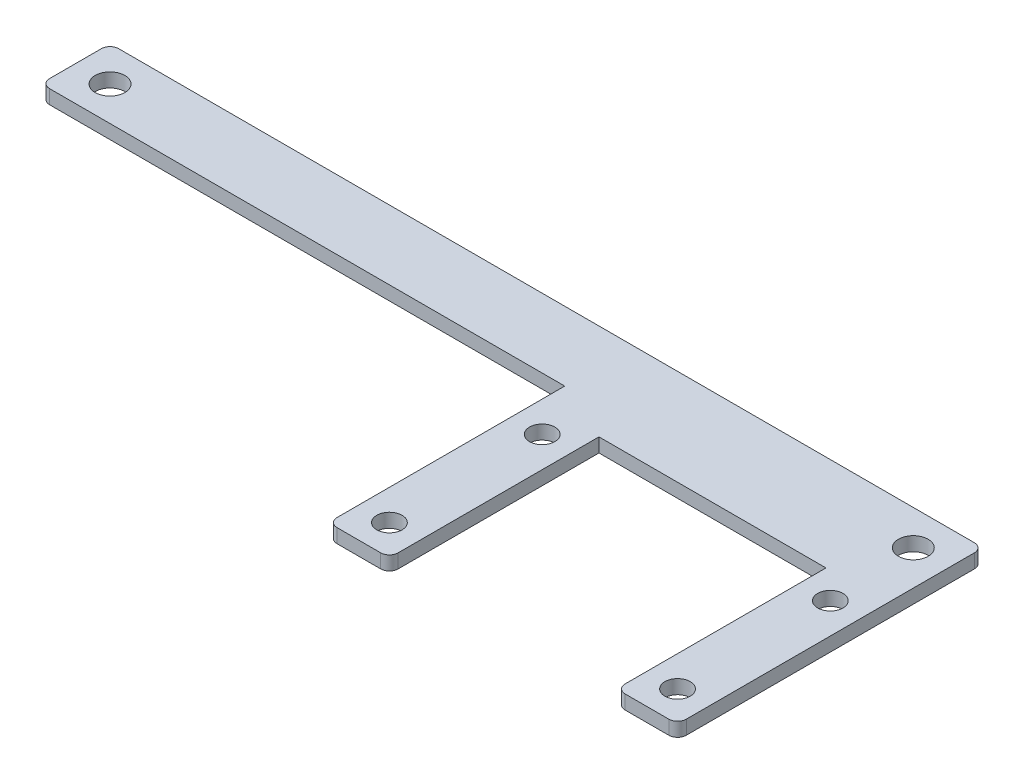
ISO-10303-21;
HEADER;
FILE_DESCRIPTION(('STEP AP214'),'2;1');
FILE_NAME('part.step','',(''),(''),'','','');
FILE_SCHEMA(('AUTOMOTIVE_DESIGN { 1 0 10303 214 1 1 1 1 }'));
ENDSEC;
DATA;
#1=APPLICATION_CONTEXT('core data for automotive mechanical design processes');
#2=APPLICATION_PROTOCOL_DEFINITION('international standard','automotive_design',2000,#1);
#3=PRODUCT_CONTEXT('',#1,'mechanical');
#4=PRODUCT('Part','Part','',(#3));
#5=PRODUCT_RELATED_PRODUCT_CATEGORY('part','',(#4));
#6=PRODUCT_DEFINITION_FORMATION('','',#4);
#7=PRODUCT_DEFINITION_CONTEXT('part definition',#1,'design');
#8=PRODUCT_DEFINITION('design','',#6,#7);
#9=PRODUCT_DEFINITION_SHAPE('','',#8);
#10=(LENGTH_UNIT() NAMED_UNIT(*) SI_UNIT(.MILLI.,.METRE.));
#11=(NAMED_UNIT(*) PLANE_ANGLE_UNIT() SI_UNIT($,.RADIAN.));
#12=(NAMED_UNIT(*) SI_UNIT($,.STERADIAN.) SOLID_ANGLE_UNIT());
#13=UNCERTAINTY_MEASURE_WITH_UNIT(LENGTH_MEASURE(1.E-05),#10,'distance_accuracy_value','');
#14=(GEOMETRIC_REPRESENTATION_CONTEXT(3) GLOBAL_UNCERTAINTY_ASSIGNED_CONTEXT((#13)) GLOBAL_UNIT_ASSIGNED_CONTEXT((#10,
#11,#12)) REPRESENTATION_CONTEXT('',''));
#15=CARTESIAN_POINT('',(0.,0.,0.));
#16=DIRECTION('',(0.,0.,1.));
#17=DIRECTION('',(1.,0.,0.));
#18=AXIS2_PLACEMENT_3D('',#15,#16,#17);
#19=CARTESIAN_POINT('',(-20.,1.6,17.5));
#20=DIRECTION('',(0.,0.,-1.));
#21=DIRECTION('',(-1.,0.,0.));
#22=AXIS2_PLACEMENT_3D('',#19,#20,#21);
#23=PLANE('',#22);
#24=DIRECTION('',(1.,0.,0.));
#25=VECTOR('',#24,1.);
#26=CARTESIAN_POINT('',(-20.,0.,17.5));
#27=LINE('',#26,#25);
#28=CARTESIAN_POINT('',(-19.,0.,17.5));
#29=VERTEX_POINT('',#28);
#30=CARTESIAN_POINT('',(-14.,0.,17.5));
#31=VERTEX_POINT('',#30);
#32=EDGE_CURVE('E195',#29,#31,#27,.T.);
#33=ORIENTED_EDGE('',*,*,#32,.T.);
#34=DIRECTION('',(0.,1.,0.));
#35=VECTOR('',#34,1.);
#36=CARTESIAN_POINT('',(-14.,1.6,17.5));
#37=LINE('',#36,#35);
#38=CARTESIAN_POINT('',(-14.,1.6,17.5));
#39=VERTEX_POINT('',#38);
#40=EDGE_CURVE('E243',#31,#39,#37,.T.);
#41=ORIENTED_EDGE('',*,*,#40,.T.);
#42=DIRECTION('',(1.,0.,0.));
#43=VECTOR('',#42,1.);
#44=CARTESIAN_POINT('',(-20.,1.6,17.5));
#45=LINE('',#44,#43);
#46=CARTESIAN_POINT('',(-19.,1.6,17.5));
#47=VERTEX_POINT('',#46);
#48=EDGE_CURVE('E176',#47,#39,#45,.T.);
#49=ORIENTED_EDGE('',*,*,#48,.F.);
#50=DIRECTION('',(0.,-1.,0.));
#51=VECTOR('',#50,1.);
#52=CARTESIAN_POINT('',(-19.,1.6,17.5));
#53=LINE('',#52,#51);
#54=EDGE_CURVE('E240',#47,#29,#53,.T.);
#55=ORIENTED_EDGE('',*,*,#54,.T.);
#56=EDGE_LOOP('',(#33,#41,#49,#55));
#57=FACE_BOUND('',#56,.T.);
#58=ADVANCED_FACE('F33',(#57),#23,.F.);
#59=CARTESIAN_POINT('',(20.,1.6,17.5));
#60=DIRECTION('',(-1.,0.,0.));
#61=DIRECTION('',(0.,0.,1.));
#62=AXIS2_PLACEMENT_3D('',#59,#60,#61);
#63=PLANE('',#62);
#64=DIRECTION('',(0.,0.,-1.));
#65=VECTOR('',#64,1.);
#66=CARTESIAN_POINT('',(20.,0.,17.5));
#67=LINE('',#66,#65);
#68=CARTESIAN_POINT('',(20.,0.,16.5));
#69=VERTEX_POINT('',#68);
#70=CARTESIAN_POINT('',(20.,0.,-16.5));
#71=VERTEX_POINT('',#70);
#72=EDGE_CURVE('E183',#69,#71,#67,.T.);
#73=ORIENTED_EDGE('',*,*,#72,.T.);
#74=DIRECTION('',(0.,-1.,0.));
#75=VECTOR('',#74,1.);
#76=CARTESIAN_POINT('',(20.,1.6,-16.5));
#77=LINE('',#76,#75);
#78=CARTESIAN_POINT('',(20.,1.6,-16.5));
#79=VERTEX_POINT('',#78);
#80=EDGE_CURVE('E218',#71,#79,#77,.F.);
#81=ORIENTED_EDGE('',*,*,#80,.T.);
#82=DIRECTION('',(0.,0.,-1.));
#83=VECTOR('',#82,1.);
#84=CARTESIAN_POINT('',(20.,1.6,17.5));
#85=LINE('',#84,#83);
#86=CARTESIAN_POINT('',(20.,1.6,16.5));
#87=VERTEX_POINT('',#86);
#88=EDGE_CURVE('E179',#87,#79,#85,.T.);
#89=ORIENTED_EDGE('',*,*,#88,.F.);
#90=DIRECTION('',(0.,-1.,0.));
#91=VECTOR('',#90,1.);
#92=CARTESIAN_POINT('',(20.,1.6,16.5));
#93=LINE('',#92,#91);
#94=EDGE_CURVE('E215',#87,#69,#93,.T.);
#95=ORIENTED_EDGE('',*,*,#94,.T.);
#96=EDGE_LOOP('',(#73,#81,#89,#95));
#97=FACE_BOUND('',#96,.T.);
#98=ADVANCED_FACE('F353',(#97),#63,.F.);
#99=CARTESIAN_POINT('',(-20.,1.6,-17.5));
#100=DIRECTION('',(0.,0.,1.));
#101=DIRECTION('',(1.,0.,0.));
#102=AXIS2_PLACEMENT_3D('',#99,#100,#101);
#103=PLANE('',#102);
#104=DIRECTION('',(-1.,0.,0.));
#105=VECTOR('',#104,1.);
#106=CARTESIAN_POINT('',(-20.,1.6,-17.5));
#107=LINE('',#106,#105);
#108=CARTESIAN_POINT('',(19.,1.6,-17.5));
#109=VERTEX_POINT('',#108);
#110=CARTESIAN_POINT('',(-79.,1.6,-17.5));
#111=VERTEX_POINT('',#110);
#112=EDGE_CURVE('E173',#109,#111,#107,.T.);
#113=ORIENTED_EDGE('',*,*,#112,.F.);
#114=DIRECTION('',(0.,-1.,0.));
#115=VECTOR('',#114,1.);
#116=CARTESIAN_POINT('',(19.,1.6,-17.5));
#117=LINE('',#116,#115);
#118=CARTESIAN_POINT('',(19.,0.,-17.5));
#119=VERTEX_POINT('',#118);
#120=EDGE_CURVE('E198',#109,#119,#117,.T.);
#121=ORIENTED_EDGE('',*,*,#120,.T.);
#122=DIRECTION('',(-1.,0.,0.));
#123=VECTOR('',#122,1.);
#124=CARTESIAN_POINT('',(-20.,0.,-17.5));
#125=LINE('',#124,#123);
#126=CARTESIAN_POINT('',(-79.,0.,-17.5));
#127=VERTEX_POINT('',#126);
#128=EDGE_CURVE('E186',#119,#127,#125,.T.);
#129=ORIENTED_EDGE('',*,*,#128,.T.);
#130=DIRECTION('',(0.,-1.,0.));
#131=VECTOR('',#130,1.);
#132=CARTESIAN_POINT('',(-79.,1.6,-17.5));
#133=LINE('',#132,#131);
#134=EDGE_CURVE('E196',#127,#111,#133,.F.);
#135=ORIENTED_EDGE('',*,*,#134,.T.);
#136=EDGE_LOOP('',(#113,#121,#129,#135));
#137=FACE_BOUND('',#136,.T.);
#138=ADVANCED_FACE('F360',(#137),#103,.F.);
#139=CARTESIAN_POINT('',(-20.,1.6,17.5));
#140=DIRECTION('',(1.,0.,0.));
#141=DIRECTION('',(0.,0.,-1.));
#142=AXIS2_PLACEMENT_3D('',#139,#140,#141);
#143=PLANE('',#142);
#144=DIRECTION('',(0.,0.,1.));
#145=VECTOR('',#144,1.);
#146=CARTESIAN_POINT('',(-20.,0.,17.5));
#147=LINE('',#146,#145);
#148=CARTESIAN_POINT('',(-20.,0.,-9.57890316251004));
#149=VERTEX_POINT('',#148);
#150=CARTESIAN_POINT('',(-20.,0.,16.5));
#151=VERTEX_POINT('',#150);
#152=EDGE_CURVE('E190',#149,#151,#147,.T.);
#153=ORIENTED_EDGE('',*,*,#152,.T.);
#154=DIRECTION('',(0.,-1.,0.));
#155=VECTOR('',#154,1.);
#156=CARTESIAN_POINT('',(-20.,1.6,16.5));
#157=LINE('',#156,#155);
#158=CARTESIAN_POINT('',(-20.,1.6,16.5));
#159=VERTEX_POINT('',#158);
#160=EDGE_CURVE('E48',#151,#159,#157,.F.);
#161=ORIENTED_EDGE('',*,*,#160,.T.);
#162=DIRECTION('',(0.,0.,1.));
#163=VECTOR('',#162,1.);
#164=CARTESIAN_POINT('',(-20.,1.6,17.5));
#165=LINE('',#164,#163);
#166=CARTESIAN_POINT('',(-20.,1.6,-9.57890316251004));
#167=VERTEX_POINT('',#166);
#168=EDGE_CURVE('E156',#167,#159,#165,.T.);
#169=ORIENTED_EDGE('',*,*,#168,.F.);
#170=DIRECTION('',(0.,-1.,0.));
#171=VECTOR('',#170,1.);
#172=CARTESIAN_POINT('',(-20.,62.1206062024241,-9.57890316251004));
#173=LINE('',#172,#171);
#174=EDGE_CURVE('E164',#167,#149,#173,.T.);
#175=ORIENTED_EDGE('',*,*,#174,.T.);
#176=EDGE_LOOP('',(#153,#161,#169,#175));
#177=FACE_BOUND('',#176,.T.);
#178=ADVANCED_FACE('F171',(#177),#143,.F.);
#179=CARTESIAN_POINT('',(14.,0.,17.5));
#180=VERTEX_POINT('',#179);
#181=CARTESIAN_POINT('',(19.,0.,17.5));
#182=VERTEX_POINT('',#181);
#183=EDGE_CURVE('E192',#180,#182,#27,.T.);
#184=ORIENTED_EDGE('',*,*,#183,.T.);
#185=DIRECTION('',(0.,-1.,0.));
#186=VECTOR('',#185,1.);
#187=CARTESIAN_POINT('',(19.,1.6,17.5));
#188=LINE('',#187,#186);
#189=CARTESIAN_POINT('',(19.,1.6,17.5));
#190=VERTEX_POINT('',#189);
#191=EDGE_CURVE('E235',#182,#190,#188,.F.);
#192=ORIENTED_EDGE('',*,*,#191,.T.);
#193=CARTESIAN_POINT('',(14.,1.6,17.5));
#194=VERTEX_POINT('',#193);
#195=EDGE_CURVE('E172',#194,#190,#45,.T.);
#196=ORIENTED_EDGE('',*,*,#195,.F.);
#197=DIRECTION('',(0.,1.,0.));
#198=VECTOR('',#197,1.);
#199=CARTESIAN_POINT('',(14.,1.6,17.5));
#200=LINE('',#199,#198);
#201=EDGE_CURVE('E233',#194,#180,#200,.F.);
#202=ORIENTED_EDGE('',*,*,#201,.T.);
#203=EDGE_LOOP('',(#184,#192,#196,#202));
#204=FACE_BOUND('',#203,.T.);
#205=ADVANCED_FACE('F345',(#204),#23,.F.);
#206=CARTESIAN_POINT('',(0.,1.6,0.));
#207=DIRECTION('',(0.,-1.,0.));
#208=DIRECTION('',(0.,0.,-1.));
#209=AXIS2_PLACEMENT_3D('',#206,#207,#208);
#210=PLANE('',#209);
#211=CARTESIAN_POINT('',(-76.,1.6,-13.5));
#212=DIRECTION('',(0.,1.,0.));
#213=DIRECTION('',(0.,0.,1.));
#214=AXIS2_PLACEMENT_3D('',#211,#212,#213);
#215=CIRCLE('',#214,1.7);
#216=CARTESIAN_POINT('',(-76.,1.6,-11.8));
#217=VERTEX_POINT('',#216);
#218=EDGE_CURVE('E616',#217,#217,#215,.T.);
#219=ORIENTED_EDGE('',*,*,#218,.F.);
#220=EDGE_LOOP('',(#219));
#221=FACE_BOUND('',#220,.T.);
#222=CARTESIAN_POINT('',(16.,1.6,-13.5));
#223=DIRECTION('',(0.,1.,0.));
#224=DIRECTION('',(0.,0.,1.));
#225=AXIS2_PLACEMENT_3D('',#222,#223,#224);
#226=CIRCLE('',#225,1.7);
#227=CARTESIAN_POINT('',(16.,1.6,-11.8));
#228=VERTEX_POINT('',#227);
#229=EDGE_CURVE('E611',#228,#228,#226,.T.);
#230=ORIENTED_EDGE('',*,*,#229,.F.);
#231=EDGE_LOOP('',(#230));
#232=FACE_BOUND('',#231,.T.);
#233=CARTESIAN_POINT('',(16.5,1.6,14.));
#234=DIRECTION('',(0.,1.,0.));
#235=DIRECTION('',(0.,0.,1.));
#236=AXIS2_PLACEMENT_3D('',#233,#234,#235);
#237=CIRCLE('',#236,1.45);
#238=CARTESIAN_POINT('',(16.5,1.6,15.45));
#239=VERTEX_POINT('',#238);
#240=EDGE_CURVE('E273',#239,#239,#237,.T.);
#241=ORIENTED_EDGE('',*,*,#240,.F.);
#242=EDGE_LOOP('',(#241));
#243=FACE_BOUND('',#242,.T.);
#244=CARTESIAN_POINT('',(16.5,1.6,-3.5));
#245=DIRECTION('',(0.,1.,0.));
#246=DIRECTION('',(0.,0.,1.));
#247=AXIS2_PLACEMENT_3D('',#244,#245,#246);
#248=CIRCLE('',#247,1.45);
#249=CARTESIAN_POINT('',(16.5,1.6,-2.05));
#250=VERTEX_POINT('',#249);
#251=EDGE_CURVE('E272',#250,#250,#248,.T.);
#252=ORIENTED_EDGE('',*,*,#251,.F.);
#253=EDGE_LOOP('',(#252));
#254=FACE_BOUND('',#253,.T.);
#255=CARTESIAN_POINT('',(-16.5,1.6,14.));
#256=DIRECTION('',(0.,1.,0.));
#257=DIRECTION('',(0.,0.,1.));
#258=AXIS2_PLACEMENT_3D('',#255,#256,#257);
#259=CIRCLE('',#258,1.45);
#260=CARTESIAN_POINT('',(-16.5,1.6,15.45));
#261=VERTEX_POINT('',#260);
#262=EDGE_CURVE('E300',#261,#261,#259,.T.);
#263=ORIENTED_EDGE('',*,*,#262,.F.);
#264=EDGE_LOOP('',(#263));
#265=FACE_BOUND('',#264,.T.);
#266=CARTESIAN_POINT('',(-16.5,1.6,-3.5));
#267=DIRECTION('',(0.,1.,0.));
#268=DIRECTION('',(0.,0.,1.));
#269=AXIS2_PLACEMENT_3D('',#266,#267,#268);
#270=CIRCLE('',#269,1.45);
#271=CARTESIAN_POINT('',(-16.5,1.6,-2.05));
#272=VERTEX_POINT('',#271);
#273=EDGE_CURVE('E299',#272,#272,#270,.T.);
#274=ORIENTED_EDGE('',*,*,#273,.F.);
#275=EDGE_LOOP('',(#274));
#276=FACE_BOUND('',#275,.T.);
#277=ORIENTED_EDGE('',*,*,#88,.T.);
#278=CARTESIAN_POINT('',(19.,1.6,-16.5));
#279=DIRECTION('',(0.,-1.,0.));
#280=DIRECTION('',(0.,0.,-1.));
#281=AXIS2_PLACEMENT_3D('',#278,#279,#280);
#282=CIRCLE('',#281,1.);
#283=EDGE_CURVE('E231',#79,#109,#282,.F.);
#284=ORIENTED_EDGE('',*,*,#283,.T.);
#285=ORIENTED_EDGE('',*,*,#112,.T.);
#286=CARTESIAN_POINT('',(-79.,1.6,-16.5));
#287=DIRECTION('',(0.,-1.,0.));
#288=DIRECTION('',(0.,0.,-1.));
#289=AXIS2_PLACEMENT_3D('',#286,#287,#288);
#290=CIRCLE('',#289,1.);
#291=CARTESIAN_POINT('',(-80.,1.6,-16.5));
#292=VERTEX_POINT('',#291);
#293=EDGE_CURVE('E221',#111,#292,#290,.F.);
#294=ORIENTED_EDGE('',*,*,#293,.T.);
#295=DIRECTION('',(0.,0.,1.));
#296=VECTOR('',#295,1.);
#297=CARTESIAN_POINT('',(-80.,1.6,-17.5));
#298=LINE('',#297,#296);
#299=CARTESIAN_POINT('',(-80.,1.6,-10.57890316251));
#300=VERTEX_POINT('',#299);
#301=EDGE_CURVE('E161',#292,#300,#298,.T.);
#302=ORIENTED_EDGE('',*,*,#301,.T.);
#303=CARTESIAN_POINT('',(-79.,1.6,-10.57890316251));
#304=DIRECTION('',(0.,-1.,0.));
#305=DIRECTION('',(0.,0.,-1.));
#306=AXIS2_PLACEMENT_3D('',#303,#304,#305);
#307=CIRCLE('',#306,1.);
#308=CARTESIAN_POINT('',(-79.,1.6,-9.57890316251004));
#309=VERTEX_POINT('',#308);
#310=EDGE_CURVE('E56',#300,#309,#307,.F.);
#311=ORIENTED_EDGE('',*,*,#310,.T.);
#312=DIRECTION('',(1.,0.,0.));
#313=VECTOR('',#312,1.);
#314=CARTESIAN_POINT('',(-20.,1.6,-9.57890316251004));
#315=LINE('',#314,#313);
#316=EDGE_CURVE('E152',#309,#167,#315,.T.);
#317=ORIENTED_EDGE('',*,*,#316,.T.);
#318=ORIENTED_EDGE('',*,*,#168,.T.);
#319=CARTESIAN_POINT('',(-19.,1.6,16.5));
#320=DIRECTION('',(0.,-1.,0.));
#321=DIRECTION('',(0.,0.,-1.));
#322=AXIS2_PLACEMENT_3D('',#319,#320,#321);
#323=CIRCLE('',#322,1.);
#324=EDGE_CURVE('E223',#159,#47,#323,.F.);
#325=ORIENTED_EDGE('',*,*,#324,.T.);
#326=ORIENTED_EDGE('',*,*,#48,.T.);
#327=CARTESIAN_POINT('',(-14.,1.6,16.5));
#328=DIRECTION('',(0.,-1.,0.));
#329=DIRECTION('',(0.,0.,-1.));
#330=AXIS2_PLACEMENT_3D('',#327,#328,#329);
#331=CIRCLE('',#330,1.);
#332=CARTESIAN_POINT('',(-13.,1.6,16.5));
#333=VERTEX_POINT('',#332);
#334=EDGE_CURVE('E225',#39,#333,#331,.F.);
#335=ORIENTED_EDGE('',*,*,#334,.T.);
#336=DIRECTION('',(0.,0.,1.));
#337=VECTOR('',#336,1.);
#338=CARTESIAN_POINT('',(-13.,1.6,17.5));
#339=LINE('',#338,#337);
#340=CARTESIAN_POINT('',(-13.,1.6,-6.5));
#341=VERTEX_POINT('',#340);
#342=EDGE_CURVE('E160',#341,#333,#339,.T.);
#343=ORIENTED_EDGE('',*,*,#342,.F.);
#344=DIRECTION('',(-1.,0.,0.));
#345=VECTOR('',#344,1.);
#346=CARTESIAN_POINT('',(-13.,1.6,-6.5));
#347=LINE('',#346,#345);
#348=CARTESIAN_POINT('',(13.,1.6,-6.50000000000001));
#349=VERTEX_POINT('',#348);
#350=EDGE_CURVE('E281',#349,#341,#347,.T.);
#351=ORIENTED_EDGE('',*,*,#350,.F.);
#352=DIRECTION('',(0.,0.,-1.));
#353=VECTOR('',#352,1.);
#354=CARTESIAN_POINT('',(13.,1.6,17.5));
#355=LINE('',#354,#353);
#356=CARTESIAN_POINT('',(13.,1.6,16.5));
#357=VERTEX_POINT('',#356);
#358=EDGE_CURVE('E289',#357,#349,#355,.T.);
#359=ORIENTED_EDGE('',*,*,#358,.F.);
#360=CARTESIAN_POINT('',(14.,1.6,16.5));
#361=DIRECTION('',(0.,-1.,0.));
#362=DIRECTION('',(0.,0.,-1.));
#363=AXIS2_PLACEMENT_3D('',#360,#361,#362);
#364=CIRCLE('',#363,1.);
#365=EDGE_CURVE('E227',#357,#194,#364,.F.);
#366=ORIENTED_EDGE('',*,*,#365,.T.);
#367=ORIENTED_EDGE('',*,*,#195,.T.);
#368=CARTESIAN_POINT('',(19.,1.6,16.5));
#369=DIRECTION('',(0.,-1.,0.));
#370=DIRECTION('',(0.,0.,-1.));
#371=AXIS2_PLACEMENT_3D('',#368,#369,#370);
#372=CIRCLE('',#371,1.);
#373=EDGE_CURVE('E229',#190,#87,#372,.F.);
#374=ORIENTED_EDGE('',*,*,#373,.T.);
#375=EDGE_LOOP('',(#277,#284,#285,#294,#302,#311,#317,#318,#325,#326,#335,#343,#351,#359,#366,
#367,#374));
#376=FACE_BOUND('',#375,.T.);
#377=ADVANCED_FACE('F155',(#221,#232,#243,#254,#265,#276,#376),#210,.F.);
#378=CARTESIAN_POINT('',(0.,0.,0.));
#379=DIRECTION('',(0.,-1.,0.));
#380=DIRECTION('',(0.,0.,-1.));
#381=AXIS2_PLACEMENT_3D('',#378,#379,#380);
#382=PLANE('',#381);
#383=CARTESIAN_POINT('',(-76.,0.,-13.5));
#384=DIRECTION('',(0.,1.,0.));
#385=DIRECTION('',(0.,0.,1.));
#386=AXIS2_PLACEMENT_3D('',#383,#384,#385);
#387=CIRCLE('',#386,1.7);
#388=CARTESIAN_POINT('',(-76.,0.,-11.8));
#389=VERTEX_POINT('',#388);
#390=EDGE_CURVE('E608',#389,#389,#387,.T.);
#391=ORIENTED_EDGE('',*,*,#390,.T.);
#392=EDGE_LOOP('',(#391));
#393=FACE_BOUND('',#392,.T.);
#394=CARTESIAN_POINT('',(16.,0.,-13.5));
#395=DIRECTION('',(0.,1.,0.));
#396=DIRECTION('',(0.,0.,1.));
#397=AXIS2_PLACEMENT_3D('',#394,#395,#396);
#398=CIRCLE('',#397,1.7);
#399=CARTESIAN_POINT('',(16.,0.,-11.8));
#400=VERTEX_POINT('',#399);
#401=EDGE_CURVE('E265',#400,#400,#398,.T.);
#402=ORIENTED_EDGE('',*,*,#401,.T.);
#403=EDGE_LOOP('',(#402));
#404=FACE_BOUND('',#403,.T.);
#405=ORIENTED_EDGE('',*,*,#128,.F.);
#406=CARTESIAN_POINT('',(19.,0.,-16.5));
#407=DIRECTION('',(0.,-1.,0.));
#408=DIRECTION('',(0.,0.,-1.));
#409=AXIS2_PLACEMENT_3D('',#406,#407,#408);
#410=CIRCLE('',#409,1.);
#411=EDGE_CURVE('E213',#119,#71,#410,.T.);
#412=ORIENTED_EDGE('',*,*,#411,.T.);
#413=ORIENTED_EDGE('',*,*,#72,.F.);
#414=CARTESIAN_POINT('',(19.,0.,16.5));
#415=DIRECTION('',(0.,-1.,0.));
#416=DIRECTION('',(0.,0.,-1.));
#417=AXIS2_PLACEMENT_3D('',#414,#415,#416);
#418=CIRCLE('',#417,1.);
#419=EDGE_CURVE('E211',#69,#182,#418,.T.);
#420=ORIENTED_EDGE('',*,*,#419,.T.);
#421=ORIENTED_EDGE('',*,*,#183,.F.);
#422=CARTESIAN_POINT('',(14.,0.,16.5));
#423=DIRECTION('',(0.,-1.,0.));
#424=DIRECTION('',(0.,0.,-1.));
#425=AXIS2_PLACEMENT_3D('',#422,#423,#424);
#426=CIRCLE('',#425,1.);
#427=CARTESIAN_POINT('',(13.,0.,16.5));
#428=VERTEX_POINT('',#427);
#429=EDGE_CURVE('E209',#180,#428,#426,.T.);
#430=ORIENTED_EDGE('',*,*,#429,.T.);
#431=DIRECTION('',(0.,0.,-1.));
#432=VECTOR('',#431,1.);
#433=CARTESIAN_POINT('',(13.,0.,17.5));
#434=LINE('',#433,#432);
#435=CARTESIAN_POINT('',(13.,0.,-6.50000000000001));
#436=VERTEX_POINT('',#435);
#437=EDGE_CURVE('E280',#428,#436,#434,.T.);
#438=ORIENTED_EDGE('',*,*,#437,.T.);
#439=DIRECTION('',(-1.,0.,0.));
#440=VECTOR('',#439,1.);
#441=CARTESIAN_POINT('',(-13.,0.,-6.5));
#442=LINE('',#441,#440);
#443=CARTESIAN_POINT('',(-13.,0.,-6.5));
#444=VERTEX_POINT('',#443);
#445=EDGE_CURVE('E283',#436,#444,#442,.T.);
#446=ORIENTED_EDGE('',*,*,#445,.T.);
#447=DIRECTION('',(0.,0.,1.));
#448=VECTOR('',#447,1.);
#449=CARTESIAN_POINT('',(-13.,0.,17.5));
#450=LINE('',#449,#448);
#451=CARTESIAN_POINT('',(-13.,0.,16.5));
#452=VERTEX_POINT('',#451);
#453=EDGE_CURVE('E277',#444,#452,#450,.T.);
#454=ORIENTED_EDGE('',*,*,#453,.T.);
#455=CARTESIAN_POINT('',(-14.,0.,16.5));
#456=DIRECTION('',(0.,-1.,0.));
#457=DIRECTION('',(0.,0.,-1.));
#458=AXIS2_PLACEMENT_3D('',#455,#456,#457);
#459=CIRCLE('',#458,1.);
#460=EDGE_CURVE('E207',#452,#31,#459,.T.);
#461=ORIENTED_EDGE('',*,*,#460,.T.);
#462=ORIENTED_EDGE('',*,*,#32,.F.);
#463=CARTESIAN_POINT('',(-19.,0.,16.5));
#464=DIRECTION('',(0.,-1.,0.));
#465=DIRECTION('',(0.,0.,-1.));
#466=AXIS2_PLACEMENT_3D('',#463,#464,#465);
#467=CIRCLE('',#466,1.);
#468=EDGE_CURVE('E205',#29,#151,#467,.T.);
#469=ORIENTED_EDGE('',*,*,#468,.T.);
#470=ORIENTED_EDGE('',*,*,#152,.F.);
#471=DIRECTION('',(-1.,0.,0.));
#472=VECTOR('',#471,1.);
#473=CARTESIAN_POINT('',(-20.,0.,-9.57890316251004));
#474=LINE('',#473,#472);
#475=CARTESIAN_POINT('',(-79.,0.,-9.57890316251004));
#476=VERTEX_POINT('',#475);
#477=EDGE_CURVE('E167',#149,#476,#474,.T.);
#478=ORIENTED_EDGE('',*,*,#477,.T.);
#479=CARTESIAN_POINT('',(-79.,0.,-10.57890316251));
#480=DIRECTION('',(0.,-1.,0.));
#481=DIRECTION('',(0.,0.,-1.));
#482=AXIS2_PLACEMENT_3D('',#479,#480,#481);
#483=CIRCLE('',#482,1.);
#484=CARTESIAN_POINT('',(-80.,0.,-10.57890316251));
#485=VERTEX_POINT('',#484);
#486=EDGE_CURVE('E201',#476,#485,#483,.T.);
#487=ORIENTED_EDGE('',*,*,#486,.T.);
#488=DIRECTION('',(0.,0.,-1.));
#489=VECTOR('',#488,1.);
#490=CARTESIAN_POINT('',(-80.,0.,-17.5));
#491=LINE('',#490,#489);
#492=CARTESIAN_POINT('',(-80.,0.,-16.5));
#493=VERTEX_POINT('',#492);
#494=EDGE_CURVE('E169',#485,#493,#491,.T.);
#495=ORIENTED_EDGE('',*,*,#494,.T.);
#496=CARTESIAN_POINT('',(-79.,0.,-16.5));
#497=DIRECTION('',(0.,-1.,0.));
#498=DIRECTION('',(0.,0.,-1.));
#499=AXIS2_PLACEMENT_3D('',#496,#497,#498);
#500=CIRCLE('',#499,1.);
#501=EDGE_CURVE('E203',#493,#127,#500,.T.);
#502=ORIENTED_EDGE('',*,*,#501,.T.);
#503=EDGE_LOOP('',(#405,#412,#413,#420,#421,#430,#438,#446,#454,#461,#462,#469,#470,#478,#487,
#495,#502));
#504=FACE_BOUND('',#503,.T.);
#505=CARTESIAN_POINT('',(16.5,0.,14.));
#506=DIRECTION('',(0.,1.,0.));
#507=DIRECTION('',(0.,0.,1.));
#508=AXIS2_PLACEMENT_3D('',#505,#506,#507);
#509=CIRCLE('',#508,1.45);
#510=CARTESIAN_POINT('',(16.5,0.,15.45));
#511=VERTEX_POINT('',#510);
#512=EDGE_CURVE('E269',#511,#511,#509,.T.);
#513=ORIENTED_EDGE('',*,*,#512,.T.);
#514=EDGE_LOOP('',(#513));
#515=FACE_BOUND('',#514,.T.);
#516=CARTESIAN_POINT('',(16.5,0.,-3.5));
#517=DIRECTION('',(0.,1.,0.));
#518=DIRECTION('',(0.,0.,1.));
#519=AXIS2_PLACEMENT_3D('',#516,#517,#518);
#520=CIRCLE('',#519,1.45);
#521=CARTESIAN_POINT('',(16.5,0.,-2.05));
#522=VERTEX_POINT('',#521);
#523=EDGE_CURVE('E303',#522,#522,#520,.T.);
#524=ORIENTED_EDGE('',*,*,#523,.T.);
#525=EDGE_LOOP('',(#524));
#526=FACE_BOUND('',#525,.T.);
#527=CARTESIAN_POINT('',(-16.5,0.,14.));
#528=DIRECTION('',(0.,1.,0.));
#529=DIRECTION('',(0.,0.,1.));
#530=AXIS2_PLACEMENT_3D('',#527,#528,#529);
#531=CIRCLE('',#530,1.45);
#532=CARTESIAN_POINT('',(-16.5,0.,15.45));
#533=VERTEX_POINT('',#532);
#534=EDGE_CURVE('E296',#533,#533,#531,.T.);
#535=ORIENTED_EDGE('',*,*,#534,.T.);
#536=EDGE_LOOP('',(#535));
#537=FACE_BOUND('',#536,.T.);
#538=CARTESIAN_POINT('',(-16.5,0.,-3.5));
#539=DIRECTION('',(0.,1.,0.));
#540=DIRECTION('',(0.,0.,1.));
#541=AXIS2_PLACEMENT_3D('',#538,#539,#540);
#542=CIRCLE('',#541,1.45);
#543=CARTESIAN_POINT('',(-16.5,0.,-2.05));
#544=VERTEX_POINT('',#543);
#545=EDGE_CURVE('E187',#544,#544,#542,.T.);
#546=ORIENTED_EDGE('',*,*,#545,.T.);
#547=EDGE_LOOP('',(#546));
#548=FACE_BOUND('',#547,.T.);
#549=ADVANCED_FACE('F262',(#393,#404,#504,#515,#526,#537,#548),#382,.T.);
#550=CARTESIAN_POINT('',(-16.5,0.,-3.5));
#551=DIRECTION('',(0.,1.,0.));
#552=DIRECTION('',(0.,0.,1.));
#553=AXIS2_PLACEMENT_3D('',#550,#551,#552);
#554=CYLINDRICAL_SURFACE('',#553,1.45);
#555=ORIENTED_EDGE('',*,*,#545,.F.);
#556=EDGE_LOOP('',(#555));
#557=FACE_BOUND('',#556,.T.);
#558=ORIENTED_EDGE('',*,*,#273,.T.);
#559=EDGE_LOOP('',(#558));
#560=FACE_BOUND('',#559,.T.);
#561=ADVANCED_FACE('F479',(#557,#560),#554,.F.);
#562=CARTESIAN_POINT('',(-16.5,0.,14.));
#563=DIRECTION('',(0.,1.,0.));
#564=DIRECTION('',(0.,0.,1.));
#565=AXIS2_PLACEMENT_3D('',#562,#563,#564);
#566=CYLINDRICAL_SURFACE('',#565,1.45);
#567=ORIENTED_EDGE('',*,*,#534,.F.);
#568=EDGE_LOOP('',(#567));
#569=FACE_BOUND('',#568,.T.);
#570=ORIENTED_EDGE('',*,*,#262,.T.);
#571=EDGE_LOOP('',(#570));
#572=FACE_BOUND('',#571,.T.);
#573=ADVANCED_FACE('F539',(#569,#572),#566,.F.);
#574=CARTESIAN_POINT('',(16.5,0.,-3.5));
#575=DIRECTION('',(0.,1.,0.));
#576=DIRECTION('',(0.,0.,1.));
#577=AXIS2_PLACEMENT_3D('',#574,#575,#576);
#578=CYLINDRICAL_SURFACE('',#577,1.45);
#579=ORIENTED_EDGE('',*,*,#523,.F.);
#580=EDGE_LOOP('',(#579));
#581=FACE_BOUND('',#580,.T.);
#582=ORIENTED_EDGE('',*,*,#251,.T.);
#583=EDGE_LOOP('',(#582));
#584=FACE_BOUND('',#583,.T.);
#585=ADVANCED_FACE('F530',(#581,#584),#578,.F.);
#586=CARTESIAN_POINT('',(16.5,0.,14.));
#587=DIRECTION('',(0.,1.,0.));
#588=DIRECTION('',(0.,0.,1.));
#589=AXIS2_PLACEMENT_3D('',#586,#587,#588);
#590=CYLINDRICAL_SURFACE('',#589,1.45);
#591=ORIENTED_EDGE('',*,*,#512,.F.);
#592=EDGE_LOOP('',(#591));
#593=FACE_BOUND('',#592,.T.);
#594=ORIENTED_EDGE('',*,*,#240,.T.);
#595=EDGE_LOOP('',(#594));
#596=FACE_BOUND('',#595,.T.);
#597=ADVANCED_FACE('F523',(#593,#596),#590,.F.);
#598=CARTESIAN_POINT('',(-13.,0.,17.5));
#599=DIRECTION('',(-1.,0.,0.));
#600=DIRECTION('',(0.,0.,1.));
#601=AXIS2_PLACEMENT_3D('',#598,#599,#600);
#602=PLANE('',#601);
#603=ORIENTED_EDGE('',*,*,#342,.T.);
#604=DIRECTION('',(0.,1.,0.));
#605=VECTOR('',#604,1.);
#606=CARTESIAN_POINT('',(-13.,0.,16.5));
#607=LINE('',#606,#605);
#608=EDGE_CURVE('E246',#333,#452,#607,.F.);
#609=ORIENTED_EDGE('',*,*,#608,.T.);
#610=ORIENTED_EDGE('',*,*,#453,.F.);
#611=DIRECTION('',(0.,1.,0.));
#612=VECTOR('',#611,1.);
#613=CARTESIAN_POINT('',(-13.,0.,-6.5));
#614=LINE('',#613,#612);
#615=EDGE_CURVE('E276',#444,#341,#614,.T.);
#616=ORIENTED_EDGE('',*,*,#615,.T.);
#617=EDGE_LOOP('',(#603,#609,#610,#616));
#618=FACE_BOUND('',#617,.T.);
#619=ADVANCED_FACE('F327',(#618),#602,.F.);
#620=CARTESIAN_POINT('',(-13.,0.,-6.5));
#621=DIRECTION('',(0.,0.,-1.));
#622=DIRECTION('',(-1.,0.,0.));
#623=AXIS2_PLACEMENT_3D('',#620,#621,#622);
#624=PLANE('',#623);
#625=ORIENTED_EDGE('',*,*,#350,.T.);
#626=ORIENTED_EDGE('',*,*,#615,.F.);
#627=ORIENTED_EDGE('',*,*,#445,.F.);
#628=DIRECTION('',(0.,1.,0.));
#629=VECTOR('',#628,1.);
#630=CARTESIAN_POINT('',(13.,0.,-6.50000000000001));
#631=LINE('',#630,#629);
#632=EDGE_CURVE('E286',#436,#349,#631,.T.);
#633=ORIENTED_EDGE('',*,*,#632,.T.);
#634=EDGE_LOOP('',(#625,#626,#627,#633));
#635=FACE_BOUND('',#634,.T.);
#636=ADVANCED_FACE('F331',(#635),#624,.F.);
#637=CARTESIAN_POINT('',(13.,0.,17.5));
#638=DIRECTION('',(1.,0.,0.));
#639=DIRECTION('',(0.,0.,-1.));
#640=AXIS2_PLACEMENT_3D('',#637,#638,#639);
#641=PLANE('',#640);
#642=ORIENTED_EDGE('',*,*,#437,.F.);
#643=DIRECTION('',(0.,1.,0.));
#644=VECTOR('',#643,1.);
#645=CARTESIAN_POINT('',(13.,0.,16.5));
#646=LINE('',#645,#644);
#647=EDGE_CURVE('E237',#428,#357,#646,.T.);
#648=ORIENTED_EDGE('',*,*,#647,.T.);
#649=ORIENTED_EDGE('',*,*,#358,.T.);
#650=ORIENTED_EDGE('',*,*,#632,.F.);
#651=EDGE_LOOP('',(#642,#648,#649,#650));
#652=FACE_BOUND('',#651,.T.);
#653=ADVANCED_FACE('F337',(#652),#641,.F.);
#654=CARTESIAN_POINT('',(-80.,62.1206062024241,-17.5));
#655=DIRECTION('',(-1.,0.,0.));
#656=DIRECTION('',(0.,0.,1.));
#657=AXIS2_PLACEMENT_3D('',#654,#655,#656);
#658=PLANE('',#657);
#659=ORIENTED_EDGE('',*,*,#301,.F.);
#660=DIRECTION('',(0.,-1.,0.));
#661=VECTOR('',#660,1.);
#662=CARTESIAN_POINT('',(-80.,0.,-16.5));
#663=LINE('',#662,#661);
#664=EDGE_CURVE('E41',#292,#493,#663,.T.);
#665=ORIENTED_EDGE('',*,*,#664,.T.);
#666=ORIENTED_EDGE('',*,*,#494,.F.);
#667=DIRECTION('',(0.,-1.,0.));
#668=VECTOR('',#667,1.);
#669=CARTESIAN_POINT('',(-80.,62.1206062024241,-10.57890316251));
#670=LINE('',#669,#668);
#671=EDGE_CURVE('E249',#485,#300,#670,.F.);
#672=ORIENTED_EDGE('',*,*,#671,.T.);
#673=EDGE_LOOP('',(#659,#665,#666,#672));
#674=FACE_BOUND('',#673,.T.);
#675=ADVANCED_FACE('F256',(#674),#658,.T.);
#676=CARTESIAN_POINT('',(-20.,62.1206062024241,-9.57890316251004));
#677=DIRECTION('',(0.,0.,1.));
#678=DIRECTION('',(1.,0.,0.));
#679=AXIS2_PLACEMENT_3D('',#676,#677,#678);
#680=PLANE('',#679);
#681=ORIENTED_EDGE('',*,*,#316,.F.);
#682=DIRECTION('',(0.,-1.,0.));
#683=VECTOR('',#682,1.);
#684=CARTESIAN_POINT('',(-79.,62.1206062024241,-9.57890316251004));
#685=LINE('',#684,#683);
#686=EDGE_CURVE('E11',#309,#476,#685,.T.);
#687=ORIENTED_EDGE('',*,*,#686,.T.);
#688=ORIENTED_EDGE('',*,*,#477,.F.);
#689=ORIENTED_EDGE('',*,*,#174,.F.);
#690=EDGE_LOOP('',(#681,#687,#688,#689));
#691=FACE_BOUND('',#690,.T.);
#692=ADVANCED_FACE('F165',(#691),#680,.T.);
#693=CARTESIAN_POINT('',(16.,0.,-13.5));
#694=DIRECTION('',(0.,1.,0.));
#695=DIRECTION('',(0.,0.,1.));
#696=AXIS2_PLACEMENT_3D('',#693,#694,#695);
#697=CYLINDRICAL_SURFACE('',#696,1.7);
#698=ORIENTED_EDGE('',*,*,#401,.F.);
#699=EDGE_LOOP('',(#698));
#700=FACE_BOUND('',#699,.T.);
#701=ORIENTED_EDGE('',*,*,#229,.T.);
#702=EDGE_LOOP('',(#701));
#703=FACE_BOUND('',#702,.T.);
#704=ADVANCED_FACE('F446',(#700,#703),#697,.F.);
#705=CARTESIAN_POINT('',(-76.,0.,-13.5));
#706=DIRECTION('',(0.,1.,0.));
#707=DIRECTION('',(0.,0.,1.));
#708=AXIS2_PLACEMENT_3D('',#705,#706,#707);
#709=CYLINDRICAL_SURFACE('',#708,1.7);
#710=ORIENTED_EDGE('',*,*,#390,.F.);
#711=EDGE_LOOP('',(#710));
#712=FACE_BOUND('',#711,.T.);
#713=ORIENTED_EDGE('',*,*,#218,.T.);
#714=EDGE_LOOP('',(#713));
#715=FACE_BOUND('',#714,.T.);
#716=ADVANCED_FACE('F395',(#712,#715),#709,.F.);
#717=CARTESIAN_POINT('',(19.,1.6,-16.5));
#718=DIRECTION('',(0.,-1.,0.));
#719=DIRECTION('',(0.,0.,-1.));
#720=AXIS2_PLACEMENT_3D('',#717,#718,#719);
#721=CYLINDRICAL_SURFACE('',#720,1.);
#722=ORIENTED_EDGE('',*,*,#283,.F.);
#723=ORIENTED_EDGE('',*,*,#80,.F.);
#724=ORIENTED_EDGE('',*,*,#411,.F.);
#725=ORIENTED_EDGE('',*,*,#120,.F.);
#726=EDGE_LOOP('',(#722,#723,#724,#725));
#727=FACE_BOUND('',#726,.T.);
#728=ADVANCED_FACE('F356',(#727),#721,.T.);
#729=CARTESIAN_POINT('',(19.,1.6,16.5));
#730=DIRECTION('',(0.,-1.,0.));
#731=DIRECTION('',(0.,0.,-1.));
#732=AXIS2_PLACEMENT_3D('',#729,#730,#731);
#733=CYLINDRICAL_SURFACE('',#732,1.);
#734=ORIENTED_EDGE('',*,*,#373,.F.);
#735=ORIENTED_EDGE('',*,*,#191,.F.);
#736=ORIENTED_EDGE('',*,*,#419,.F.);
#737=ORIENTED_EDGE('',*,*,#94,.F.);
#738=EDGE_LOOP('',(#734,#735,#736,#737));
#739=FACE_BOUND('',#738,.T.);
#740=ADVANCED_FACE('F351',(#739),#733,.T.);
#741=CARTESIAN_POINT('',(14.,0.,16.5));
#742=DIRECTION('',(0.,1.,0.));
#743=DIRECTION('',(0.,0.,1.));
#744=AXIS2_PLACEMENT_3D('',#741,#742,#743);
#745=CYLINDRICAL_SURFACE('',#744,1.);
#746=ORIENTED_EDGE('',*,*,#429,.F.);
#747=ORIENTED_EDGE('',*,*,#201,.F.);
#748=ORIENTED_EDGE('',*,*,#365,.F.);
#749=ORIENTED_EDGE('',*,*,#647,.F.);
#750=EDGE_LOOP('',(#746,#747,#748,#749));
#751=FACE_BOUND('',#750,.T.);
#752=ADVANCED_FACE('F341',(#751),#745,.T.);
#753=CARTESIAN_POINT('',(-14.,1.6,16.5));
#754=DIRECTION('',(0.,1.,0.));
#755=DIRECTION('',(0.,0.,1.));
#756=AXIS2_PLACEMENT_3D('',#753,#754,#755);
#757=CYLINDRICAL_SURFACE('',#756,1.);
#758=ORIENTED_EDGE('',*,*,#460,.F.);
#759=ORIENTED_EDGE('',*,*,#608,.F.);
#760=ORIENTED_EDGE('',*,*,#334,.F.);
#761=ORIENTED_EDGE('',*,*,#40,.F.);
#762=EDGE_LOOP('',(#758,#759,#760,#761));
#763=FACE_BOUND('',#762,.T.);
#764=ADVANCED_FACE('F322',(#763),#757,.T.);
#765=CARTESIAN_POINT('',(-19.,1.6,16.5));
#766=DIRECTION('',(0.,-1.,0.));
#767=DIRECTION('',(0.,0.,-1.));
#768=AXIS2_PLACEMENT_3D('',#765,#766,#767);
#769=CYLINDRICAL_SURFACE('',#768,1.);
#770=ORIENTED_EDGE('',*,*,#324,.F.);
#771=ORIENTED_EDGE('',*,*,#160,.F.);
#772=ORIENTED_EDGE('',*,*,#468,.F.);
#773=ORIENTED_EDGE('',*,*,#54,.F.);
#774=EDGE_LOOP('',(#770,#771,#772,#773));
#775=FACE_BOUND('',#774,.T.);
#776=ADVANCED_FACE('F365',(#775),#769,.T.);
#777=CARTESIAN_POINT('',(-79.,62.1206062024241,-16.5));
#778=DIRECTION('',(0.,1.,0.));
#779=DIRECTION('',(0.,0.,1.));
#780=AXIS2_PLACEMENT_3D('',#777,#778,#779);
#781=CYLINDRICAL_SURFACE('',#780,1.);
#782=ORIENTED_EDGE('',*,*,#293,.F.);
#783=ORIENTED_EDGE('',*,*,#134,.F.);
#784=ORIENTED_EDGE('',*,*,#501,.F.);
#785=ORIENTED_EDGE('',*,*,#664,.F.);
#786=EDGE_LOOP('',(#782,#783,#784,#785));
#787=FACE_BOUND('',#786,.T.);
#788=ADVANCED_FACE('F362',(#787),#781,.T.);
#789=CARTESIAN_POINT('',(-79.,62.1206062024241,-10.57890316251));
#790=DIRECTION('',(0.,-1.,0.));
#791=DIRECTION('',(0.,0.,-1.));
#792=AXIS2_PLACEMENT_3D('',#789,#790,#791);
#793=CYLINDRICAL_SURFACE('',#792,1.);
#794=ORIENTED_EDGE('',*,*,#310,.F.);
#795=ORIENTED_EDGE('',*,*,#671,.F.);
#796=ORIENTED_EDGE('',*,*,#486,.F.);
#797=ORIENTED_EDGE('',*,*,#686,.F.);
#798=EDGE_LOOP('',(#794,#795,#796,#797));
#799=FACE_BOUND('',#798,.T.);
#800=ADVANCED_FACE('F35',(#799),#793,.T.);
#801=CLOSED_SHELL('',(#58,#98,#138,#178,#205,#377,#549,#561,#573,#585,#597,#619,#636,#653,#675,
#692,#704,#716,#728,#740,#752,#764,#776,#788,#800));
#802=MANIFOLD_SOLID_BREP('B2',#801);
#803=ADVANCED_BREP_SHAPE_REPRESENTATION('',(#18,#802),#14);
#804=SHAPE_DEFINITION_REPRESENTATION(#9,#803);
ENDSEC;
END-ISO-10303-21;
